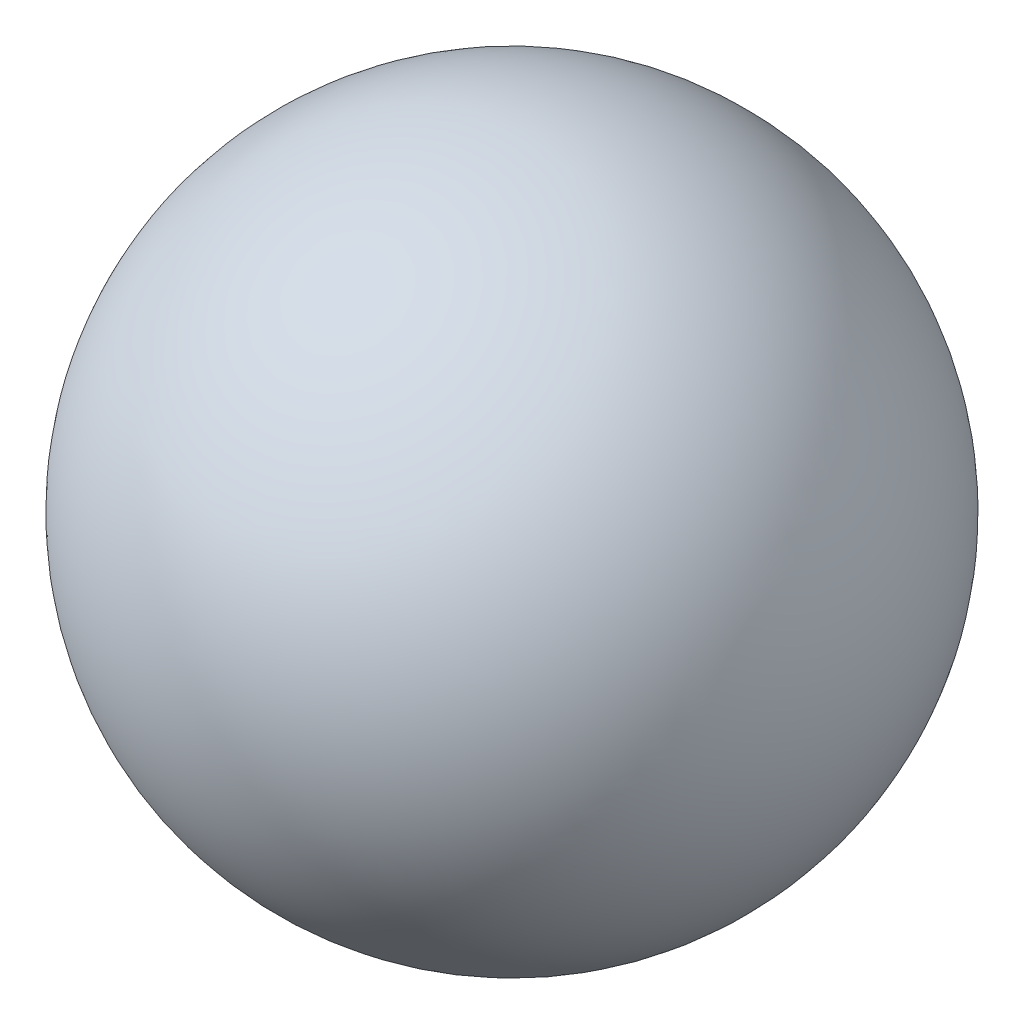
ISO-10303-21;
HEADER;
FILE_DESCRIPTION(('STEP AP214'),'2;1');
FILE_NAME('part.step','',(''),(''),'','','');
FILE_SCHEMA(('AUTOMOTIVE_DESIGN { 1 0 10303 214 1 1 1 1 }'));
ENDSEC;
DATA;
#1=APPLICATION_CONTEXT('core data for automotive mechanical design processes');
#2=APPLICATION_PROTOCOL_DEFINITION('international standard','automotive_design',2000,#1);
#3=PRODUCT_CONTEXT('',#1,'mechanical');
#4=PRODUCT('Part','Part','',(#3));
#5=PRODUCT_RELATED_PRODUCT_CATEGORY('part','',(#4));
#6=PRODUCT_DEFINITION_FORMATION('','',#4);
#7=PRODUCT_DEFINITION_CONTEXT('part definition',#1,'design');
#8=PRODUCT_DEFINITION('design','',#6,#7);
#9=PRODUCT_DEFINITION_SHAPE('','',#8);
#10=(LENGTH_UNIT() NAMED_UNIT(*) SI_UNIT(.MILLI.,.METRE.));
#11=(NAMED_UNIT(*) PLANE_ANGLE_UNIT() SI_UNIT($,.RADIAN.));
#12=(NAMED_UNIT(*) SI_UNIT($,.STERADIAN.) SOLID_ANGLE_UNIT());
#13=UNCERTAINTY_MEASURE_WITH_UNIT(LENGTH_MEASURE(1.E-05),#10,'distance_accuracy_value','');
#14=(GEOMETRIC_REPRESENTATION_CONTEXT(3) GLOBAL_UNCERTAINTY_ASSIGNED_CONTEXT((#13)) GLOBAL_UNIT_ASSIGNED_CONTEXT((#10,
#11,#12)) REPRESENTATION_CONTEXT('',''));
#15=CARTESIAN_POINT('',(0.,0.,0.));
#16=DIRECTION('',(0.,0.,1.));
#17=DIRECTION('',(1.,0.,0.));
#18=AXIS2_PLACEMENT_3D('',#15,#16,#17);
#19=CARTESIAN_POINT('',(0.,0.,0.));
#20=DIRECTION('',(-1.,0.,0.));
#21=DIRECTION('',(0.,1.,0.));
#22=AXIS2_PLACEMENT_3D('',#19,#20,#21);
#23=SPHERICAL_SURFACE('',#22,2.31648463296927);
#24=CARTESIAN_POINT('',(-2.31648463296927,0.,0.));
#25=VERTEX_POINT('',#24);
#26=VERTEX_LOOP('',#25);
#27=FACE_BOUND('',#26,.T.);
#28=ADVANCED_FACE('F37',(#27),#23,.T.);
#29=CLOSED_SHELL('',(#28));
#30=MANIFOLD_SOLID_BREP('B2',#29);
#31=ADVANCED_BREP_SHAPE_REPRESENTATION('',(#18,#30),#14);
#32=SHAPE_DEFINITION_REPRESENTATION(#9,#31);
ENDSEC;
END-ISO-10303-21;
